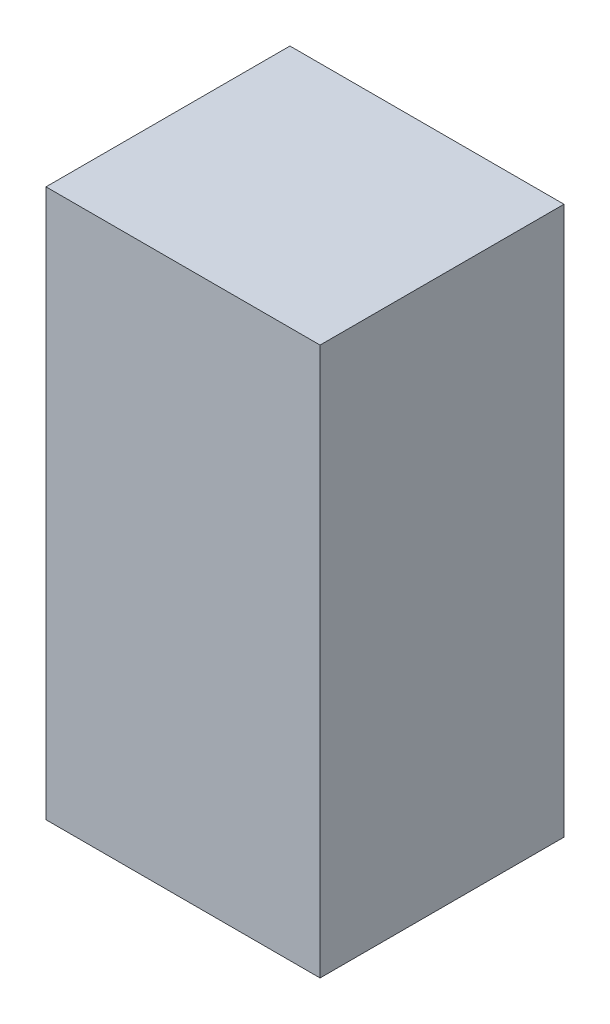
ISO-10303-21;
HEADER;
FILE_DESCRIPTION(('STEP AP214'),'2;1');
FILE_NAME('part.step','',(''),(''),'','','');
FILE_SCHEMA(('AUTOMOTIVE_DESIGN { 1 0 10303 214 1 1 1 1 }'));
ENDSEC;
DATA;
#1=APPLICATION_CONTEXT('core data for automotive mechanical design processes');
#2=APPLICATION_PROTOCOL_DEFINITION('international standard','automotive_design',2000,#1);
#3=PRODUCT_CONTEXT('',#1,'mechanical');
#4=PRODUCT('Part','Part','',(#3));
#5=PRODUCT_RELATED_PRODUCT_CATEGORY('part','',(#4));
#6=PRODUCT_DEFINITION_FORMATION('','',#4);
#7=PRODUCT_DEFINITION_CONTEXT('part definition',#1,'design');
#8=PRODUCT_DEFINITION('design','',#6,#7);
#9=PRODUCT_DEFINITION_SHAPE('','',#8);
#10=(LENGTH_UNIT() NAMED_UNIT(*) SI_UNIT(.MILLI.,.METRE.));
#11=(NAMED_UNIT(*) PLANE_ANGLE_UNIT() SI_UNIT($,.RADIAN.));
#12=(NAMED_UNIT(*) SI_UNIT($,.STERADIAN.) SOLID_ANGLE_UNIT());
#13=UNCERTAINTY_MEASURE_WITH_UNIT(LENGTH_MEASURE(1.E-05),#10,'distance_accuracy_value','');
#14=(GEOMETRIC_REPRESENTATION_CONTEXT(3) GLOBAL_UNCERTAINTY_ASSIGNED_CONTEXT((#13)) GLOBAL_UNIT_ASSIGNED_CONTEXT((#10,
#11,#12)) REPRESENTATION_CONTEXT('',''));
#15=CARTESIAN_POINT('',(0.,0.,0.));
#16=DIRECTION('',(0.,0.,1.));
#17=DIRECTION('',(1.,0.,0.));
#18=AXIS2_PLACEMENT_3D('',#15,#16,#17);
#19=CARTESIAN_POINT('',(10.,-20.,-17.8));
#20=DIRECTION('',(-1.,0.,0.));
#21=DIRECTION('',(0.,0.,-1.));
#22=AXIS2_PLACEMENT_3D('',#19,#20,#21);
#23=PLANE('',#22);
#24=DIRECTION('',(0.,1.,0.));
#25=VECTOR('',#24,1.);
#26=CARTESIAN_POINT('',(10.,-20.,0.));
#27=LINE('',#26,#25);
#28=CARTESIAN_POINT('',(10.,-20.,0.));
#29=VERTEX_POINT('',#28);
#30=CARTESIAN_POINT('',(10.,20.,0.));
#31=VERTEX_POINT('',#30);
#32=EDGE_CURVE('E105',#29,#31,#27,.T.);
#33=ORIENTED_EDGE('',*,*,#32,.F.);
#34=DIRECTION('',(0.,0.,1.));
#35=VECTOR('',#34,1.);
#36=CARTESIAN_POINT('',(10.,-20.,-17.8));
#37=LINE('',#36,#35);
#38=CARTESIAN_POINT('',(10.,-20.,-17.8));
#39=VERTEX_POINT('',#38);
#40=EDGE_CURVE('E101',#39,#29,#37,.T.);
#41=ORIENTED_EDGE('',*,*,#40,.F.);
#42=DIRECTION('',(0.,1.,0.));
#43=VECTOR('',#42,1.);
#44=CARTESIAN_POINT('',(10.,-20.,-17.8));
#45=LINE('',#44,#43);
#46=CARTESIAN_POINT('',(10.,20.,-17.8));
#47=VERTEX_POINT('',#46);
#48=EDGE_CURVE('E96',#39,#47,#45,.T.);
#49=ORIENTED_EDGE('',*,*,#48,.T.);
#50=DIRECTION('',(0.,0.,1.));
#51=VECTOR('',#50,1.);
#52=CARTESIAN_POINT('',(10.,20.,-17.8));
#53=LINE('',#52,#51);
#54=EDGE_CURVE('E11',#47,#31,#53,.T.);
#55=ORIENTED_EDGE('',*,*,#54,.T.);
#56=EDGE_LOOP('',(#33,#41,#49,#55));
#57=FACE_BOUND('',#56,.T.);
#58=ADVANCED_FACE('F39',(#57),#23,.F.);
#59=CARTESIAN_POINT('',(-10.,20.,-17.8));
#60=DIRECTION('',(0.,-1.,0.));
#61=DIRECTION('',(0.,0.,1.));
#62=AXIS2_PLACEMENT_3D('',#59,#60,#61);
#63=PLANE('',#62);
#64=DIRECTION('',(-1.,0.,0.));
#65=VECTOR('',#64,1.);
#66=CARTESIAN_POINT('',(-10.,20.,0.));
#67=LINE('',#66,#65);
#68=CARTESIAN_POINT('',(-10.,20.,0.));
#69=VERTEX_POINT('',#68);
#70=EDGE_CURVE('E102',#31,#69,#67,.T.);
#71=ORIENTED_EDGE('',*,*,#70,.F.);
#72=ORIENTED_EDGE('',*,*,#54,.F.);
#73=DIRECTION('',(-1.,0.,0.));
#74=VECTOR('',#73,1.);
#75=CARTESIAN_POINT('',(-10.,20.,-17.8));
#76=LINE('',#75,#74);
#77=CARTESIAN_POINT('',(-10.,20.,-17.8));
#78=VERTEX_POINT('',#77);
#79=EDGE_CURVE('E78',#47,#78,#76,.T.);
#80=ORIENTED_EDGE('',*,*,#79,.T.);
#81=DIRECTION('',(0.,0.,1.));
#82=VECTOR('',#81,1.);
#83=CARTESIAN_POINT('',(-10.,20.,-17.8));
#84=LINE('',#83,#82);
#85=EDGE_CURVE('E50',#78,#69,#84,.T.);
#86=ORIENTED_EDGE('',*,*,#85,.T.);
#87=EDGE_LOOP('',(#71,#72,#80,#86));
#88=FACE_BOUND('',#87,.T.);
#89=ADVANCED_FACE('F94',(#88),#63,.F.);
#90=CARTESIAN_POINT('',(-10.,-20.,-17.8));
#91=DIRECTION('',(1.,0.,0.));
#92=DIRECTION('',(0.,0.,1.));
#93=AXIS2_PLACEMENT_3D('',#90,#91,#92);
#94=PLANE('',#93);
#95=DIRECTION('',(0.,-1.,0.));
#96=VECTOR('',#95,1.);
#97=CARTESIAN_POINT('',(-10.,-20.,0.));
#98=LINE('',#97,#96);
#99=CARTESIAN_POINT('',(-10.,-20.,0.));
#100=VERTEX_POINT('',#99);
#101=EDGE_CURVE('E89',#69,#100,#98,.T.);
#102=ORIENTED_EDGE('',*,*,#101,.F.);
#103=ORIENTED_EDGE('',*,*,#85,.F.);
#104=DIRECTION('',(0.,-1.,0.));
#105=VECTOR('',#104,1.);
#106=CARTESIAN_POINT('',(-10.,-20.,-17.8));
#107=LINE('',#106,#105);
#108=CARTESIAN_POINT('',(-10.,-20.,-17.8));
#109=VERTEX_POINT('',#108);
#110=EDGE_CURVE('E84',#78,#109,#107,.T.);
#111=ORIENTED_EDGE('',*,*,#110,.T.);
#112=DIRECTION('',(0.,0.,1.));
#113=VECTOR('',#112,1.);
#114=CARTESIAN_POINT('',(-10.,-20.,-17.8));
#115=LINE('',#114,#113);
#116=EDGE_CURVE('E91',#109,#100,#115,.T.);
#117=ORIENTED_EDGE('',*,*,#116,.T.);
#118=EDGE_LOOP('',(#102,#103,#111,#117));
#119=FACE_BOUND('',#118,.T.);
#120=ADVANCED_FACE('F90',(#119),#94,.F.);
#121=CARTESIAN_POINT('',(-10.,-20.,-17.8));
#122=DIRECTION('',(0.,1.,0.));
#123=DIRECTION('',(0.,0.,-1.));
#124=AXIS2_PLACEMENT_3D('',#121,#122,#123);
#125=PLANE('',#124);
#126=DIRECTION('',(1.,0.,0.));
#127=VECTOR('',#126,1.);
#128=CARTESIAN_POINT('',(-10.,-20.,0.));
#129=LINE('',#128,#127);
#130=EDGE_CURVE('E68',#100,#29,#129,.T.);
#131=ORIENTED_EDGE('',*,*,#130,.F.);
#132=ORIENTED_EDGE('',*,*,#116,.F.);
#133=DIRECTION('',(1.,0.,0.));
#134=VECTOR('',#133,1.);
#135=CARTESIAN_POINT('',(-10.,-20.,-17.8));
#136=LINE('',#135,#134);
#137=EDGE_CURVE('E54',#109,#39,#136,.T.);
#138=ORIENTED_EDGE('',*,*,#137,.T.);
#139=ORIENTED_EDGE('',*,*,#40,.T.);
#140=EDGE_LOOP('',(#131,#132,#138,#139));
#141=FACE_BOUND('',#140,.T.);
#142=ADVANCED_FACE('F114',(#141),#125,.F.);
#143=CARTESIAN_POINT('',(0.,0.,-17.8));
#144=DIRECTION('',(0.,0.,1.));
#145=DIRECTION('',(-1.,0.,0.));
#146=AXIS2_PLACEMENT_3D('',#143,#144,#145);
#147=PLANE('',#146);
#148=ORIENTED_EDGE('',*,*,#48,.F.);
#149=ORIENTED_EDGE('',*,*,#137,.F.);
#150=ORIENTED_EDGE('',*,*,#110,.F.);
#151=ORIENTED_EDGE('',*,*,#79,.F.);
#152=EDGE_LOOP('',(#148,#149,#150,#151));
#153=FACE_BOUND('',#152,.T.);
#154=ADVANCED_FACE('F85',(#153),#147,.F.);
#155=CARTESIAN_POINT('',(0.,0.,0.));
#156=DIRECTION('',(0.,0.,1.));
#157=DIRECTION('',(-1.,0.,0.));
#158=AXIS2_PLACEMENT_3D('',#155,#156,#157);
#159=PLANE('',#158);
#160=ORIENTED_EDGE('',*,*,#32,.T.);
#161=ORIENTED_EDGE('',*,*,#70,.T.);
#162=ORIENTED_EDGE('',*,*,#101,.T.);
#163=ORIENTED_EDGE('',*,*,#130,.T.);
#164=EDGE_LOOP('',(#160,#161,#162,#163));
#165=FACE_BOUND('',#164,.T.);
#166=ADVANCED_FACE('F108',(#165),#159,.T.);
#167=CLOSED_SHELL('',(#58,#89,#120,#142,#154,#166));
#168=MANIFOLD_SOLID_BREP('B2',#167);
#169=ADVANCED_BREP_SHAPE_REPRESENTATION('',(#18,#168),#14);
#170=SHAPE_DEFINITION_REPRESENTATION(#9,#169);
ENDSEC;
END-ISO-10303-21;
